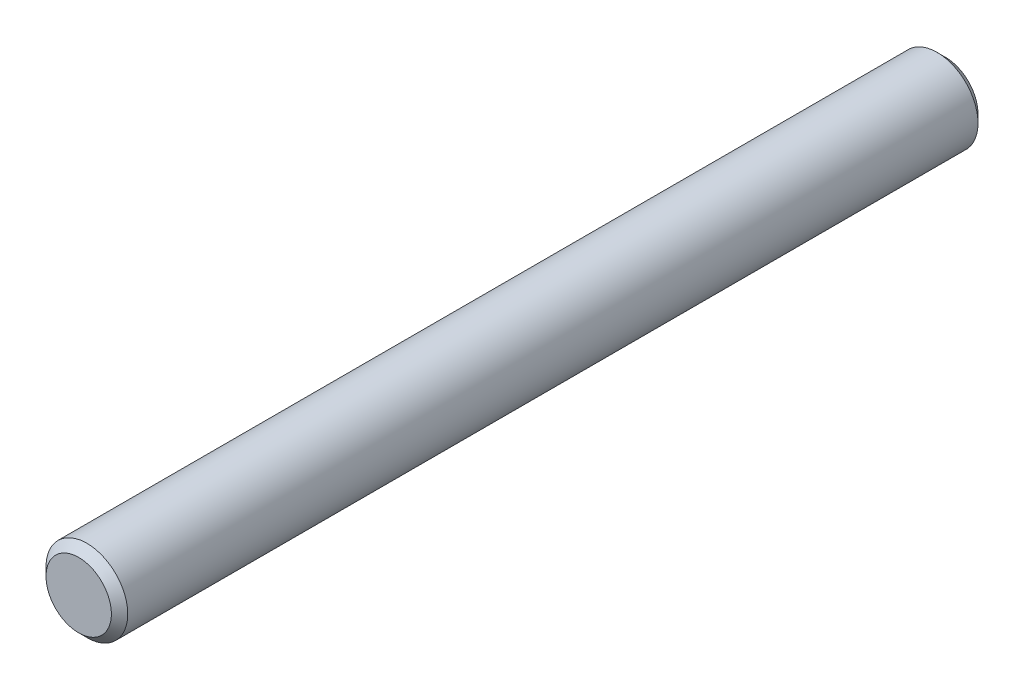
ISO-10303-21;
HEADER;
FILE_DESCRIPTION(('STEP AP214'),'2;1');
FILE_NAME('part.step','',(''),(''),'','','');
FILE_SCHEMA(('AUTOMOTIVE_DESIGN { 1 0 10303 214 1 1 1 1 }'));
ENDSEC;
DATA;
#1=APPLICATION_CONTEXT('core data for automotive mechanical design processes');
#2=APPLICATION_PROTOCOL_DEFINITION('international standard','automotive_design',2000,#1);
#3=PRODUCT_CONTEXT('',#1,'mechanical');
#4=PRODUCT('Part','Part','',(#3));
#5=PRODUCT_RELATED_PRODUCT_CATEGORY('part','',(#4));
#6=PRODUCT_DEFINITION_FORMATION('','',#4);
#7=PRODUCT_DEFINITION_CONTEXT('part definition',#1,'design');
#8=PRODUCT_DEFINITION('design','',#6,#7);
#9=PRODUCT_DEFINITION_SHAPE('','',#8);
#10=(LENGTH_UNIT() NAMED_UNIT(*) SI_UNIT(.MILLI.,.METRE.));
#11=(NAMED_UNIT(*) PLANE_ANGLE_UNIT() SI_UNIT($,.RADIAN.));
#12=(NAMED_UNIT(*) SI_UNIT($,.STERADIAN.) SOLID_ANGLE_UNIT());
#13=UNCERTAINTY_MEASURE_WITH_UNIT(LENGTH_MEASURE(1.E-05),#10,'distance_accuracy_value','');
#14=(GEOMETRIC_REPRESENTATION_CONTEXT(3) GLOBAL_UNCERTAINTY_ASSIGNED_CONTEXT((#13)) GLOBAL_UNIT_ASSIGNED_CONTEXT((#10,
#11,#12)) REPRESENTATION_CONTEXT('',''));
#15=CARTESIAN_POINT('',(0.,0.,0.));
#16=DIRECTION('',(0.,0.,1.));
#17=DIRECTION('',(1.,0.,0.));
#18=AXIS2_PLACEMENT_3D('',#15,#16,#17);
#19=CARTESIAN_POINT('',(0.,0.,-1.));
#20=DIRECTION('',(0.,0.,1.));
#21=DIRECTION('',(1.,0.,0.));
#22=AXIS2_PLACEMENT_3D('',#19,#20,#21);
#23=CYLINDRICAL_SURFACE('',#22,0.5);
#24=CARTESIAN_POINT('',(0.,0.,-0.5));
#25=DIRECTION('',(0.,0.,-1.));
#26=DIRECTION('',(-1.,0.,0.));
#27=AXIS2_PLACEMENT_3D('',#24,#25,#26);
#28=CIRCLE('',#27,0.5);
#29=CARTESIAN_POINT('',(-0.5,0.,-0.5));
#30=VERTEX_POINT('',#29);
#31=EDGE_CURVE('E10',#30,#30,#28,.F.);
#32=ORIENTED_EDGE('',*,*,#31,.T.);
#33=EDGE_LOOP('',(#32));
#34=FACE_BOUND('',#33,.T.);
#35=CARTESIAN_POINT('',(0.,0.,9.9));
#36=DIRECTION('',(0.,0.,1.));
#37=DIRECTION('',(1.,0.,0.));
#38=AXIS2_PLACEMENT_3D('',#35,#36,#37);
#39=CIRCLE('',#38,0.5);
#40=CARTESIAN_POINT('',(0.5,0.,9.9));
#41=VERTEX_POINT('',#40);
#42=EDGE_CURVE('E46',#41,#41,#39,.F.);
#43=ORIENTED_EDGE('',*,*,#42,.T.);
#44=EDGE_LOOP('',(#43));
#45=FACE_BOUND('',#44,.T.);
#46=ADVANCED_FACE('F34',(#34,#45),#23,.T.);
#47=CARTESIAN_POINT('',(0.,0.,10.));
#48=DIRECTION('',(0.,0.,1.));
#49=DIRECTION('',(1.,0.,0.));
#50=AXIS2_PLACEMENT_3D('',#47,#48,#49);
#51=PLANE('',#50);
#52=CARTESIAN_POINT('',(0.,0.,10.));
#53=DIRECTION('',(0.,0.,1.));
#54=DIRECTION('',(1.,0.,0.));
#55=AXIS2_PLACEMENT_3D('',#52,#53,#54);
#56=CIRCLE('',#55,0.399999999999999);
#57=CARTESIAN_POINT('',(0.399999999999999,0.,10.));
#58=VERTEX_POINT('',#57);
#59=EDGE_CURVE('E50',#58,#58,#56,.T.);
#60=ORIENTED_EDGE('',*,*,#59,.T.);
#61=EDGE_LOOP('',(#60));
#62=FACE_BOUND('',#61,.T.);
#63=ADVANCED_FACE('F56',(#62),#51,.T.);
#64=CARTESIAN_POINT('',(0.,0.,10.));
#65=DIRECTION('',(0.,0.,-1.));
#66=DIRECTION('',(-1.,0.,0.));
#67=AXIS2_PLACEMENT_3D('',#64,#65,#66);
#68=CONICAL_SURFACE('',#67,0.400000000000001,0.785398163397446);
#69=ORIENTED_EDGE('',*,*,#42,.F.);
#70=EDGE_LOOP('',(#69));
#71=FACE_BOUND('',#70,.T.);
#72=ORIENTED_EDGE('',*,*,#59,.F.);
#73=EDGE_LOOP('',(#72));
#74=FACE_BOUND('',#73,.T.);
#75=ADVANCED_FACE('F58',(#71,#74),#68,.T.);
#76=CARTESIAN_POINT('',(0.,0.,-0.6));
#77=DIRECTION('',(0.,0.,-1.));
#78=DIRECTION('',(-1.,0.,0.));
#79=AXIS2_PLACEMENT_3D('',#76,#77,#78);
#80=PLANE('',#79);
#81=CARTESIAN_POINT('',(0.,0.,-0.6));
#82=DIRECTION('',(0.,0.,-1.));
#83=DIRECTION('',(-1.,0.,0.));
#84=AXIS2_PLACEMENT_3D('',#81,#82,#83);
#85=CIRCLE('',#84,0.400000000000001);
#86=CARTESIAN_POINT('',(-0.400000000000001,0.,-0.6));
#87=VERTEX_POINT('',#86);
#88=EDGE_CURVE('E42',#87,#87,#85,.T.);
#89=ORIENTED_EDGE('',*,*,#88,.T.);
#90=EDGE_LOOP('',(#89));
#91=FACE_BOUND('',#90,.T.);
#92=ADVANCED_FACE('F60',(#91),#80,.T.);
#93=CARTESIAN_POINT('',(0.,0.,-0.6));
#94=DIRECTION('',(0.,0.,1.));
#95=DIRECTION('',(1.,0.,0.));
#96=AXIS2_PLACEMENT_3D('',#93,#94,#95);
#97=CONICAL_SURFACE('',#96,0.400000000000001,0.785398163397441);
#98=ORIENTED_EDGE('',*,*,#31,.F.);
#99=EDGE_LOOP('',(#98));
#100=FACE_BOUND('',#99,.T.);
#101=ORIENTED_EDGE('',*,*,#88,.F.);
#102=EDGE_LOOP('',(#101));
#103=FACE_BOUND('',#102,.T.);
#104=ADVANCED_FACE('F37',(#100,#103),#97,.T.);
#105=CLOSED_SHELL('',(#46,#63,#75,#92,#104));
#106=MANIFOLD_SOLID_BREP('B2',#105);
#107=ADVANCED_BREP_SHAPE_REPRESENTATION('',(#18,#106),#14);
#108=SHAPE_DEFINITION_REPRESENTATION(#9,#107);
ENDSEC;
END-ISO-10303-21;
